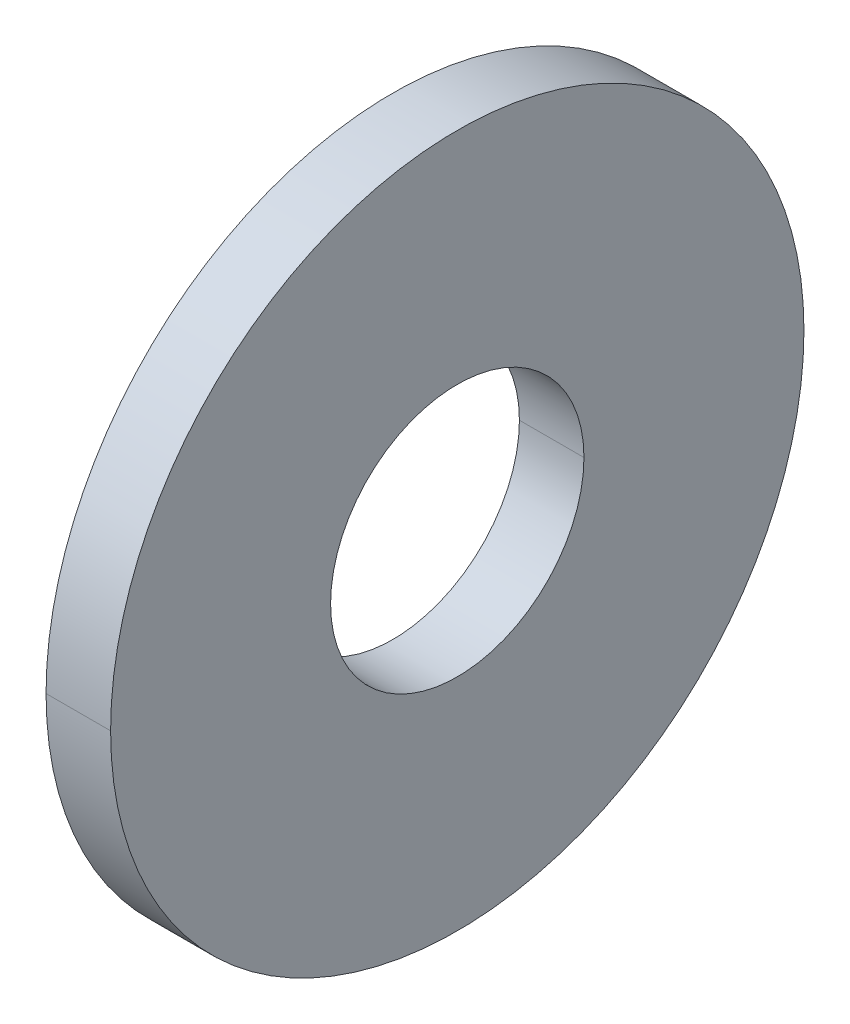
ISO-10303-21;
HEADER;
FILE_DESCRIPTION(('STEP AP214'),'2;1');
FILE_NAME('part.step','',(''),(''),'','','');
FILE_SCHEMA(('AUTOMOTIVE_DESIGN { 1 0 10303 214 1 1 1 1 }'));
ENDSEC;
DATA;
#1=APPLICATION_CONTEXT('core data for automotive mechanical design processes');
#2=APPLICATION_PROTOCOL_DEFINITION('international standard','automotive_design',2000,#1);
#3=PRODUCT_CONTEXT('',#1,'mechanical');
#4=PRODUCT('Part','Part','',(#3));
#5=PRODUCT_RELATED_PRODUCT_CATEGORY('part','',(#4));
#6=PRODUCT_DEFINITION_FORMATION('','',#4);
#7=PRODUCT_DEFINITION_CONTEXT('part definition',#1,'design');
#8=PRODUCT_DEFINITION('design','',#6,#7);
#9=PRODUCT_DEFINITION_SHAPE('','',#8);
#10=(LENGTH_UNIT() NAMED_UNIT(*) SI_UNIT(.MILLI.,.METRE.));
#11=(NAMED_UNIT(*) PLANE_ANGLE_UNIT() SI_UNIT($,.RADIAN.));
#12=(NAMED_UNIT(*) SI_UNIT($,.STERADIAN.) SOLID_ANGLE_UNIT());
#13=UNCERTAINTY_MEASURE_WITH_UNIT(LENGTH_MEASURE(1.E-05),#10,'distance_accuracy_value','');
#14=(GEOMETRIC_REPRESENTATION_CONTEXT(3) GLOBAL_UNCERTAINTY_ASSIGNED_CONTEXT((#13)) GLOBAL_UNIT_ASSIGNED_CONTEXT((#10,
#11,#12)) REPRESENTATION_CONTEXT('',''));
#15=CARTESIAN_POINT('',(0.,0.,0.));
#16=DIRECTION('',(0.,0.,1.));
#17=DIRECTION('',(1.,0.,0.));
#18=AXIS2_PLACEMENT_3D('',#15,#16,#17);
#19=CARTESIAN_POINT('',(0.,3.435,0.));
#20=DIRECTION('',(-1.,0.,0.));
#21=DIRECTION('',(0.,0.,1.));
#22=AXIS2_PLACEMENT_3D('',#19,#20,#21);
#23=PLANE('',#22);
#24=CARTESIAN_POINT('',(0.,0.,0.));
#25=DIRECTION('',(-1.,0.,0.));
#26=DIRECTION('',(0.,0.,1.));
#27=AXIS2_PLACEMENT_3D('',#24,#25,#26);
#28=CIRCLE('',#27,3.435);
#29=CARTESIAN_POINT('',(0.,0.,3.435));
#30=VERTEX_POINT('',#29);
#31=CARTESIAN_POINT('',(0.,0.,-3.435));
#32=VERTEX_POINT('',#31);
#33=EDGE_CURVE('E11',#30,#32,#28,.T.);
#34=ORIENTED_EDGE('',*,*,#33,.T.);
#35=CARTESIAN_POINT('',(0.,0.,0.));
#36=DIRECTION('',(-1.,0.,0.));
#37=DIRECTION('',(0.,0.,1.));
#38=AXIS2_PLACEMENT_3D('',#35,#36,#37);
#39=CIRCLE('',#38,3.435);
#40=EDGE_CURVE('E84',#32,#30,#39,.T.);
#41=ORIENTED_EDGE('',*,*,#40,.T.);
#42=EDGE_LOOP('',(#34,#41));
#43=FACE_BOUND('',#42,.T.);
#44=CARTESIAN_POINT('',(0.,0.,0.));
#45=DIRECTION('',(-1.,0.,0.));
#46=DIRECTION('',(0.,0.,1.));
#47=AXIS2_PLACEMENT_3D('',#44,#45,#46);
#48=CIRCLE('',#47,9.4);
#49=CARTESIAN_POINT('',(0.,0.,9.4));
#50=VERTEX_POINT('',#49);
#51=CARTESIAN_POINT('',(0.,0.,-9.4));
#52=VERTEX_POINT('',#51);
#53=EDGE_CURVE('E107',#50,#52,#48,.T.);
#54=ORIENTED_EDGE('',*,*,#53,.F.);
#55=CARTESIAN_POINT('',(0.,0.,0.));
#56=DIRECTION('',(-1.,0.,0.));
#57=DIRECTION('',(0.,0.,1.));
#58=AXIS2_PLACEMENT_3D('',#55,#56,#57);
#59=CIRCLE('',#58,9.4);
#60=EDGE_CURVE('E27',#52,#50,#59,.T.);
#61=ORIENTED_EDGE('',*,*,#60,.F.);
#62=EDGE_LOOP('',(#54,#61));
#63=FACE_BOUND('',#62,.T.);
#64=ADVANCED_FACE('F16',(#43,#63),#23,.F.);
#65=CARTESIAN_POINT('',(-34.925,0.,0.));
#66=DIRECTION('',(-1.,0.,0.));
#67=DIRECTION('',(0.,0.,1.));
#68=AXIS2_PLACEMENT_3D('',#65,#66,#67);
#69=CYLINDRICAL_SURFACE('',#68,3.435);
#70=DIRECTION('',(-1.,0.,0.));
#71=VECTOR('',#70,1.);
#72=CARTESIAN_POINT('',(-34.925,0.,-3.435));
#73=LINE('',#72,#71);
#74=CARTESIAN_POINT('',(-1.75,0.,-3.435));
#75=VERTEX_POINT('',#74);
#76=EDGE_CURVE('E88',#32,#75,#73,.T.);
#77=ORIENTED_EDGE('',*,*,#76,.F.);
#78=ORIENTED_EDGE('',*,*,#33,.F.);
#79=DIRECTION('',(-1.,0.,0.));
#80=VECTOR('',#79,1.);
#81=CARTESIAN_POINT('',(-34.925,0.,3.435));
#82=LINE('',#81,#80);
#83=CARTESIAN_POINT('',(-1.75,0.,3.435));
#84=VERTEX_POINT('',#83);
#85=EDGE_CURVE('E96',#30,#84,#82,.T.);
#86=ORIENTED_EDGE('',*,*,#85,.T.);
#87=CARTESIAN_POINT('',(-1.75,0.,0.));
#88=DIRECTION('',(-1.,0.,0.));
#89=DIRECTION('',(0.,0.,1.));
#90=AXIS2_PLACEMENT_3D('',#87,#88,#89);
#91=CIRCLE('',#90,3.435);
#92=EDGE_CURVE('E40',#84,#75,#91,.T.);
#93=ORIENTED_EDGE('',*,*,#92,.T.);
#94=EDGE_LOOP('',(#77,#78,#86,#93));
#95=FACE_BOUND('',#94,.T.);
#96=ADVANCED_FACE('F89',(#95),#69,.F.);
#97=CARTESIAN_POINT('',(-34.925,0.,0.));
#98=DIRECTION('',(-1.,0.,0.));
#99=DIRECTION('',(0.,0.,1.));
#100=AXIS2_PLACEMENT_3D('',#97,#98,#99);
#101=CYLINDRICAL_SURFACE('',#100,9.4);
#102=DIRECTION('',(-1.,0.,0.));
#103=VECTOR('',#102,1.);
#104=CARTESIAN_POINT('',(-34.925,0.,-9.4));
#105=LINE('',#104,#103);
#106=CARTESIAN_POINT('',(-1.75,0.,-9.4));
#107=VERTEX_POINT('',#106);
#108=EDGE_CURVE('E110',#52,#107,#105,.T.);
#109=ORIENTED_EDGE('',*,*,#108,.F.);
#110=ORIENTED_EDGE('',*,*,#60,.T.);
#111=DIRECTION('',(-1.,0.,0.));
#112=VECTOR('',#111,1.);
#113=CARTESIAN_POINT('',(-34.925,0.,9.4));
#114=LINE('',#113,#112);
#115=CARTESIAN_POINT('',(-1.75,0.,9.4));
#116=VERTEX_POINT('',#115);
#117=EDGE_CURVE('E98',#50,#116,#114,.T.);
#118=ORIENTED_EDGE('',*,*,#117,.T.);
#119=CARTESIAN_POINT('',(-1.75,0.,0.));
#120=DIRECTION('',(1.,0.,0.));
#121=DIRECTION('',(0.,0.,1.));
#122=AXIS2_PLACEMENT_3D('',#119,#120,#121);
#123=CIRCLE('',#122,9.4);
#124=EDGE_CURVE('E72',#116,#107,#123,.T.);
#125=ORIENTED_EDGE('',*,*,#124,.T.);
#126=EDGE_LOOP('',(#109,#110,#118,#125));
#127=FACE_BOUND('',#126,.T.);
#128=ADVANCED_FACE('F18',(#127),#101,.T.);
#129=CARTESIAN_POINT('',(-1.75,9.4,0.));
#130=DIRECTION('',(1.,0.,0.));
#131=DIRECTION('',(0.,1.,0.));
#132=AXIS2_PLACEMENT_3D('',#129,#130,#131);
#133=PLANE('',#132);
#134=ORIENTED_EDGE('',*,*,#92,.F.);
#135=CARTESIAN_POINT('',(-1.75,0.,0.));
#136=DIRECTION('',(-1.,0.,0.));
#137=DIRECTION('',(0.,0.,1.));
#138=AXIS2_PLACEMENT_3D('',#135,#136,#137);
#139=CIRCLE('',#138,3.435);
#140=EDGE_CURVE('E93',#75,#84,#139,.T.);
#141=ORIENTED_EDGE('',*,*,#140,.F.);
#142=EDGE_LOOP('',(#134,#141));
#143=FACE_BOUND('',#142,.T.);
#144=ORIENTED_EDGE('',*,*,#124,.F.);
#145=CARTESIAN_POINT('',(-1.75,0.,0.));
#146=DIRECTION('',(1.,0.,0.));
#147=DIRECTION('',(0.,0.,1.));
#148=AXIS2_PLACEMENT_3D('',#145,#146,#147);
#149=CIRCLE('',#148,9.4);
#150=EDGE_CURVE('E20',#107,#116,#149,.T.);
#151=ORIENTED_EDGE('',*,*,#150,.F.);
#152=EDGE_LOOP('',(#144,#151));
#153=FACE_BOUND('',#152,.T.);
#154=ADVANCED_FACE('F132',(#143,#153),#133,.F.);
#155=CARTESIAN_POINT('',(-34.925,0.,0.));
#156=DIRECTION('',(-1.,0.,0.));
#157=DIRECTION('',(0.,0.,1.));
#158=AXIS2_PLACEMENT_3D('',#155,#156,#157);
#159=CYLINDRICAL_SURFACE('',#158,3.435);
#160=ORIENTED_EDGE('',*,*,#40,.F.);
#161=ORIENTED_EDGE('',*,*,#76,.T.);
#162=ORIENTED_EDGE('',*,*,#140,.T.);
#163=ORIENTED_EDGE('',*,*,#85,.F.);
#164=EDGE_LOOP('',(#160,#161,#162,#163));
#165=FACE_BOUND('',#164,.T.);
#166=ADVANCED_FACE('F95',(#165),#159,.F.);
#167=CARTESIAN_POINT('',(-34.925,0.,0.));
#168=DIRECTION('',(-1.,0.,0.));
#169=DIRECTION('',(0.,0.,1.));
#170=AXIS2_PLACEMENT_3D('',#167,#168,#169);
#171=CYLINDRICAL_SURFACE('',#170,9.4);
#172=ORIENTED_EDGE('',*,*,#53,.T.);
#173=ORIENTED_EDGE('',*,*,#108,.T.);
#174=ORIENTED_EDGE('',*,*,#150,.T.);
#175=ORIENTED_EDGE('',*,*,#117,.F.);
#176=EDGE_LOOP('',(#172,#173,#174,#175));
#177=FACE_BOUND('',#176,.T.);
#178=ADVANCED_FACE('F131',(#177),#171,.T.);
#179=CLOSED_SHELL('',(#64,#96,#128,#154,#166,#178));
#180=MANIFOLD_SOLID_BREP('B1',#179);
#181=ADVANCED_BREP_SHAPE_REPRESENTATION('',(#18,#180),#14);
#182=SHAPE_DEFINITION_REPRESENTATION(#9,#181);
ENDSEC;
END-ISO-10303-21;
